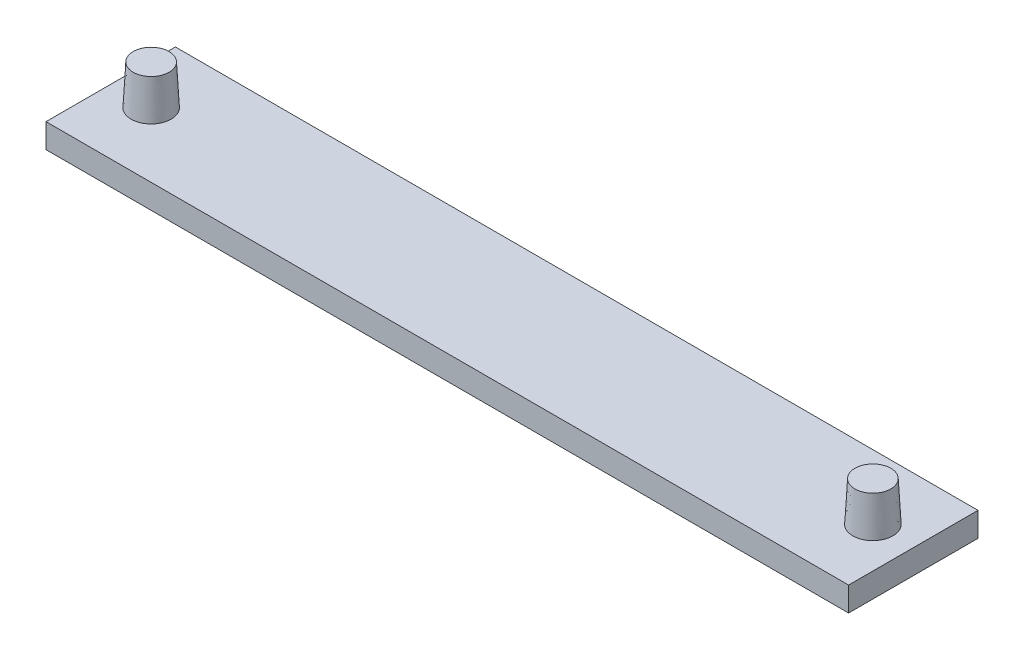
ISO-10303-21;
HEADER;
FILE_DESCRIPTION(('STEP AP214'),'2;1');
FILE_NAME('part.step','',(''),(''),'','','');
FILE_SCHEMA(('AUTOMOTIVE_DESIGN { 1 0 10303 214 1 1 1 1 }'));
ENDSEC;
DATA;
#1=APPLICATION_CONTEXT('core data for automotive mechanical design processes');
#2=APPLICATION_PROTOCOL_DEFINITION('international standard','automotive_design',2000,#1);
#3=PRODUCT_CONTEXT('',#1,'mechanical');
#4=PRODUCT('Part','Part','',(#3));
#5=PRODUCT_RELATED_PRODUCT_CATEGORY('part','',(#4));
#6=PRODUCT_DEFINITION_FORMATION('','',#4);
#7=PRODUCT_DEFINITION_CONTEXT('part definition',#1,'design');
#8=PRODUCT_DEFINITION('design','',#6,#7);
#9=PRODUCT_DEFINITION_SHAPE('','',#8);
#10=(LENGTH_UNIT() NAMED_UNIT(*) SI_UNIT(.MILLI.,.METRE.));
#11=(NAMED_UNIT(*) PLANE_ANGLE_UNIT() SI_UNIT($,.RADIAN.));
#12=(NAMED_UNIT(*) SI_UNIT($,.STERADIAN.) SOLID_ANGLE_UNIT());
#13=UNCERTAINTY_MEASURE_WITH_UNIT(LENGTH_MEASURE(1.E-05),#10,'distance_accuracy_value','');
#14=(GEOMETRIC_REPRESENTATION_CONTEXT(3) GLOBAL_UNCERTAINTY_ASSIGNED_CONTEXT((#13)) GLOBAL_UNIT_ASSIGNED_CONTEXT((#10,
#11,#12)) REPRESENTATION_CONTEXT('',''));
#15=CARTESIAN_POINT('',(0.,0.,0.));
#16=DIRECTION('',(0.,0.,1.));
#17=DIRECTION('',(1.,0.,0.));
#18=AXIS2_PLACEMENT_3D('',#15,#16,#17);
#19=CARTESIAN_POINT('',(-4.17338691038083,3.,2.89774806999235));
#20=DIRECTION('',(1.,0.,0.));
#21=DIRECTION('',(0.,0.,-1.));
#22=AXIS2_PLACEMENT_3D('',#19,#20,#21);
#23=PLANE('',#22);
#24=DIRECTION('',(0.,0.,1.));
#25=VECTOR('',#24,1.);
#26=CARTESIAN_POINT('',(-4.17338691038083,0.,2.89774806999235));
#27=LINE('',#26,#25);
#28=CARTESIAN_POINT('',(-4.17338691038083,0.,-13.1022519300077));
#29=VERTEX_POINT('',#28);
#30=CARTESIAN_POINT('',(-4.17338691038083,0.,2.89774806999235));
#31=VERTEX_POINT('',#30);
#32=EDGE_CURVE('E119',#29,#31,#27,.T.);
#33=ORIENTED_EDGE('',*,*,#32,.T.);
#34=DIRECTION('',(0.,-1.,0.));
#35=VECTOR('',#34,1.);
#36=CARTESIAN_POINT('',(-4.17338691038083,3.,2.89774806999235));
#37=LINE('',#36,#35);
#38=CARTESIAN_POINT('',(-4.17338691038083,3.,2.89774806999235));
#39=VERTEX_POINT('',#38);
#40=EDGE_CURVE('E106',#39,#31,#37,.T.);
#41=ORIENTED_EDGE('',*,*,#40,.F.);
#42=DIRECTION('',(0.,0.,1.));
#43=VECTOR('',#42,1.);
#44=CARTESIAN_POINT('',(-4.17338691038083,3.,2.89774806999235));
#45=LINE('',#44,#43);
#46=CARTESIAN_POINT('',(-4.17338691038083,3.,-13.1022519300077));
#47=VERTEX_POINT('',#46);
#48=EDGE_CURVE('E99',#47,#39,#45,.T.);
#49=ORIENTED_EDGE('',*,*,#48,.F.);
#50=DIRECTION('',(0.,-1.,0.));
#51=VECTOR('',#50,1.);
#52=CARTESIAN_POINT('',(-4.17338691038083,3.,-13.1022519300077));
#53=LINE('',#52,#51);
#54=EDGE_CURVE('E115',#47,#29,#53,.T.);
#55=ORIENTED_EDGE('',*,*,#54,.T.);
#56=EDGE_LOOP('',(#33,#41,#49,#55));
#57=FACE_BOUND('',#56,.T.);
#58=ADVANCED_FACE('F40',(#57),#23,.F.);
#59=CARTESIAN_POINT('',(-4.17338691038083,3.,2.89774806999235));
#60=DIRECTION('',(0.,0.,-1.));
#61=DIRECTION('',(-1.,0.,0.));
#62=AXIS2_PLACEMENT_3D('',#59,#60,#61);
#63=PLANE('',#62);
#64=DIRECTION('',(1.,0.,0.));
#65=VECTOR('',#64,1.);
#66=CARTESIAN_POINT('',(-4.17338691038083,0.,2.89774806999235));
#67=LINE('',#66,#65);
#68=CARTESIAN_POINT('',(95.0766130896192,0.,2.89774806999235));
#69=VERTEX_POINT('',#68);
#70=EDGE_CURVE('E105',#31,#69,#67,.T.);
#71=ORIENTED_EDGE('',*,*,#70,.T.);
#72=DIRECTION('',(0.,-1.,0.));
#73=VECTOR('',#72,1.);
#74=CARTESIAN_POINT('',(95.0766130896192,3.,2.89774806999235));
#75=LINE('',#74,#73);
#76=CARTESIAN_POINT('',(95.0766130896192,3.,2.89774806999235));
#77=VERTEX_POINT('',#76);
#78=EDGE_CURVE('E103',#77,#69,#75,.T.);
#79=ORIENTED_EDGE('',*,*,#78,.F.);
#80=DIRECTION('',(1.,0.,0.));
#81=VECTOR('',#80,1.);
#82=CARTESIAN_POINT('',(-4.17338691038083,3.,2.89774806999235));
#83=LINE('',#82,#81);
#84=EDGE_CURVE('E94',#39,#77,#83,.T.);
#85=ORIENTED_EDGE('',*,*,#84,.F.);
#86=ORIENTED_EDGE('',*,*,#40,.T.);
#87=EDGE_LOOP('',(#71,#79,#85,#86));
#88=FACE_BOUND('',#87,.T.);
#89=ADVANCED_FACE('F104',(#88),#63,.F.);
#90=CARTESIAN_POINT('',(95.0766130896192,3.,2.89774806999235));
#91=DIRECTION('',(-1.,0.,0.));
#92=DIRECTION('',(0.,0.,1.));
#93=AXIS2_PLACEMENT_3D('',#90,#91,#92);
#94=PLANE('',#93);
#95=DIRECTION('',(0.,0.,-1.));
#96=VECTOR('',#95,1.);
#97=CARTESIAN_POINT('',(95.0766130896192,0.,2.89774806999235));
#98=LINE('',#97,#96);
#99=CARTESIAN_POINT('',(95.0766130896192,0.,-13.1022519300077));
#100=VERTEX_POINT('',#99);
#101=EDGE_CURVE('E79',#69,#100,#98,.T.);
#102=ORIENTED_EDGE('',*,*,#101,.T.);
#103=DIRECTION('',(0.,-1.,0.));
#104=VECTOR('',#103,1.);
#105=CARTESIAN_POINT('',(95.0766130896192,3.,-13.1022519300077));
#106=LINE('',#105,#104);
#107=CARTESIAN_POINT('',(95.0766130896192,3.,-13.1022519300077));
#108=VERTEX_POINT('',#107);
#109=EDGE_CURVE('E107',#108,#100,#106,.T.);
#110=ORIENTED_EDGE('',*,*,#109,.F.);
#111=DIRECTION('',(0.,0.,-1.));
#112=VECTOR('',#111,1.);
#113=CARTESIAN_POINT('',(95.0766130896192,3.,2.89774806999235));
#114=LINE('',#113,#112);
#115=EDGE_CURVE('E97',#77,#108,#114,.T.);
#116=ORIENTED_EDGE('',*,*,#115,.F.);
#117=ORIENTED_EDGE('',*,*,#78,.T.);
#118=EDGE_LOOP('',(#102,#110,#116,#117));
#119=FACE_BOUND('',#118,.T.);
#120=ADVANCED_FACE('F109',(#119),#94,.F.);
#121=CARTESIAN_POINT('',(-4.17338691038083,3.,-13.1022519300077));
#122=DIRECTION('',(0.,0.,1.));
#123=DIRECTION('',(1.,0.,0.));
#124=AXIS2_PLACEMENT_3D('',#121,#122,#123);
#125=PLANE('',#124);
#126=DIRECTION('',(-1.,0.,0.));
#127=VECTOR('',#126,1.);
#128=CARTESIAN_POINT('',(-4.17338691038083,0.,-13.1022519300077));
#129=LINE('',#128,#127);
#130=EDGE_CURVE('E86',#100,#29,#129,.T.);
#131=ORIENTED_EDGE('',*,*,#130,.T.);
#132=ORIENTED_EDGE('',*,*,#54,.F.);
#133=DIRECTION('',(-1.,0.,0.));
#134=VECTOR('',#133,1.);
#135=CARTESIAN_POINT('',(-4.17338691038083,3.,-13.1022519300077));
#136=LINE('',#135,#134);
#137=EDGE_CURVE('E59',#108,#47,#136,.T.);
#138=ORIENTED_EDGE('',*,*,#137,.F.);
#139=ORIENTED_EDGE('',*,*,#109,.T.);
#140=EDGE_LOOP('',(#131,#132,#138,#139));
#141=FACE_BOUND('',#140,.T.);
#142=ADVANCED_FACE('F142',(#141),#125,.F.);
#143=CARTESIAN_POINT('',(0.,3.,0.));
#144=DIRECTION('',(0.,-1.,0.));
#145=DIRECTION('',(0.,0.,-1.));
#146=AXIS2_PLACEMENT_3D('',#143,#144,#145);
#147=PLANE('',#146);
#148=CARTESIAN_POINT('',(90.0766130896192,3.,-5.10225193000765));
#149=DIRECTION('',(0.,-1.,0.));
#150=DIRECTION('',(0.,0.,-1.));
#151=AXIS2_PLACEMENT_3D('',#148,#149,#150);
#152=CIRCLE('',#151,2.47500000000001);
#153=CARTESIAN_POINT('',(90.0766130896192,3.,-7.57725193000766));
#154=VERTEX_POINT('',#153);
#155=EDGE_CURVE('E11',#154,#154,#152,.F.);
#156=ORIENTED_EDGE('',*,*,#155,.F.);
#157=EDGE_LOOP('',(#156));
#158=FACE_BOUND('',#157,.T.);
#159=CARTESIAN_POINT('',(0.826613089619173,3.,-5.10225193000765));
#160=DIRECTION('',(0.,-1.,0.));
#161=DIRECTION('',(0.,0.,-1.));
#162=AXIS2_PLACEMENT_3D('',#159,#160,#161);
#163=CIRCLE('',#162,2.475);
#164=CARTESIAN_POINT('',(0.826613089619173,3.,-7.57725193000765));
#165=VERTEX_POINT('',#164);
#166=EDGE_CURVE('E49',#165,#165,#163,.F.);
#167=ORIENTED_EDGE('',*,*,#166,.F.);
#168=EDGE_LOOP('',(#167));
#169=FACE_BOUND('',#168,.T.);
#170=ORIENTED_EDGE('',*,*,#48,.T.);
#171=ORIENTED_EDGE('',*,*,#84,.T.);
#172=ORIENTED_EDGE('',*,*,#115,.T.);
#173=ORIENTED_EDGE('',*,*,#137,.T.);
#174=EDGE_LOOP('',(#170,#171,#172,#173));
#175=FACE_BOUND('',#174,.T.);
#176=ADVANCED_FACE('F95',(#158,#169,#175),#147,.F.);
#177=CARTESIAN_POINT('',(0.,0.,0.));
#178=DIRECTION('',(0.,-1.,0.));
#179=DIRECTION('',(0.,0.,-1.));
#180=AXIS2_PLACEMENT_3D('',#177,#178,#179);
#181=PLANE('',#180);
#182=ORIENTED_EDGE('',*,*,#32,.F.);
#183=ORIENTED_EDGE('',*,*,#130,.F.);
#184=ORIENTED_EDGE('',*,*,#101,.F.);
#185=ORIENTED_EDGE('',*,*,#70,.F.);
#186=EDGE_LOOP('',(#182,#183,#184,#185));
#187=FACE_BOUND('',#186,.T.);
#188=ADVANCED_FACE('F141',(#187),#181,.T.);
#189=CARTESIAN_POINT('',(0.826613089619173,3.,-5.10225193000765));
#190=DIRECTION('',(0.,-1.,0.));
#191=DIRECTION('',(0.,0.,1.));
#192=AXIS2_PLACEMENT_3D('',#189,#190,#191);
#193=CONICAL_SURFACE('',#192,2.475,0.0523598775598299);
#194=CARTESIAN_POINT('',(0.826613089619173,7.9,-5.10225193000765));
#195=DIRECTION('',(0.,1.,0.));
#196=DIRECTION('',(0.,0.,1.));
#197=AXIS2_PLACEMENT_3D('',#194,#195,#196);
#198=CIRCLE('',#197,2.2182018815131);
#199=CARTESIAN_POINT('',(0.826613089619173,7.9,-2.88405004849455));
#200=VERTEX_POINT('',#199);
#201=EDGE_CURVE('E123',#200,#200,#198,.T.);
#202=ORIENTED_EDGE('',*,*,#201,.F.);
#203=EDGE_LOOP('',(#202));
#204=FACE_BOUND('',#203,.T.);
#205=ORIENTED_EDGE('',*,*,#166,.T.);
#206=EDGE_LOOP('',(#205));
#207=FACE_BOUND('',#206,.T.);
#208=ADVANCED_FACE('F138',(#204,#207),#193,.T.);
#209=CARTESIAN_POINT('',(0.826613089619173,7.9,-5.10225193000765));
#210=DIRECTION('',(0.,1.,0.));
#211=DIRECTION('',(0.,0.,1.));
#212=AXIS2_PLACEMENT_3D('',#209,#210,#211);
#213=PLANE('',#212);
#214=ORIENTED_EDGE('',*,*,#201,.T.);
#215=EDGE_LOOP('',(#214));
#216=FACE_BOUND('',#215,.T.);
#217=ADVANCED_FACE('F174',(#216),#213,.T.);
#218=CARTESIAN_POINT('',(90.0766130896192,3.,-5.10225193000765));
#219=DIRECTION('',(0.,-1.,0.));
#220=DIRECTION('',(0.,0.,1.));
#221=AXIS2_PLACEMENT_3D('',#218,#219,#220);
#222=CONICAL_SURFACE('',#221,2.47500000000001,0.0523598775598299);
#223=CARTESIAN_POINT('',(90.0766130896192,7.9,-5.10225193000765));
#224=DIRECTION('',(0.,1.,0.));
#225=DIRECTION('',(0.,0.,1.));
#226=AXIS2_PLACEMENT_3D('',#223,#224,#225);
#227=CIRCLE('',#226,2.21820188151311);
#228=CARTESIAN_POINT('',(90.0766130896192,7.9,-2.88405004849454));
#229=VERTEX_POINT('',#228);
#230=EDGE_CURVE('E164',#229,#229,#227,.T.);
#231=ORIENTED_EDGE('',*,*,#230,.F.);
#232=EDGE_LOOP('',(#231));
#233=FACE_BOUND('',#232,.T.);
#234=ORIENTED_EDGE('',*,*,#155,.T.);
#235=EDGE_LOOP('',(#234));
#236=FACE_BOUND('',#235,.T.);
#237=ADVANCED_FACE('F171',(#233,#236),#222,.T.);
#238=CARTESIAN_POINT('',(90.0766130896192,7.9,-5.10225193000765));
#239=DIRECTION('',(0.,1.,0.));
#240=DIRECTION('',(0.,0.,1.));
#241=AXIS2_PLACEMENT_3D('',#238,#239,#240);
#242=PLANE('',#241);
#243=ORIENTED_EDGE('',*,*,#230,.T.);
#244=EDGE_LOOP('',(#243));
#245=FACE_BOUND('',#244,.T.);
#246=ADVANCED_FACE('F169',(#245),#242,.T.);
#247=CLOSED_SHELL('',(#58,#89,#120,#142,#176,#188,#208,#217,#237,#246));
#248=MANIFOLD_SOLID_BREP('B2',#247);
#249=ADVANCED_BREP_SHAPE_REPRESENTATION('',(#18,#248),#14);
#250=SHAPE_DEFINITION_REPRESENTATION(#9,#249);
ENDSEC;
END-ISO-10303-21;
